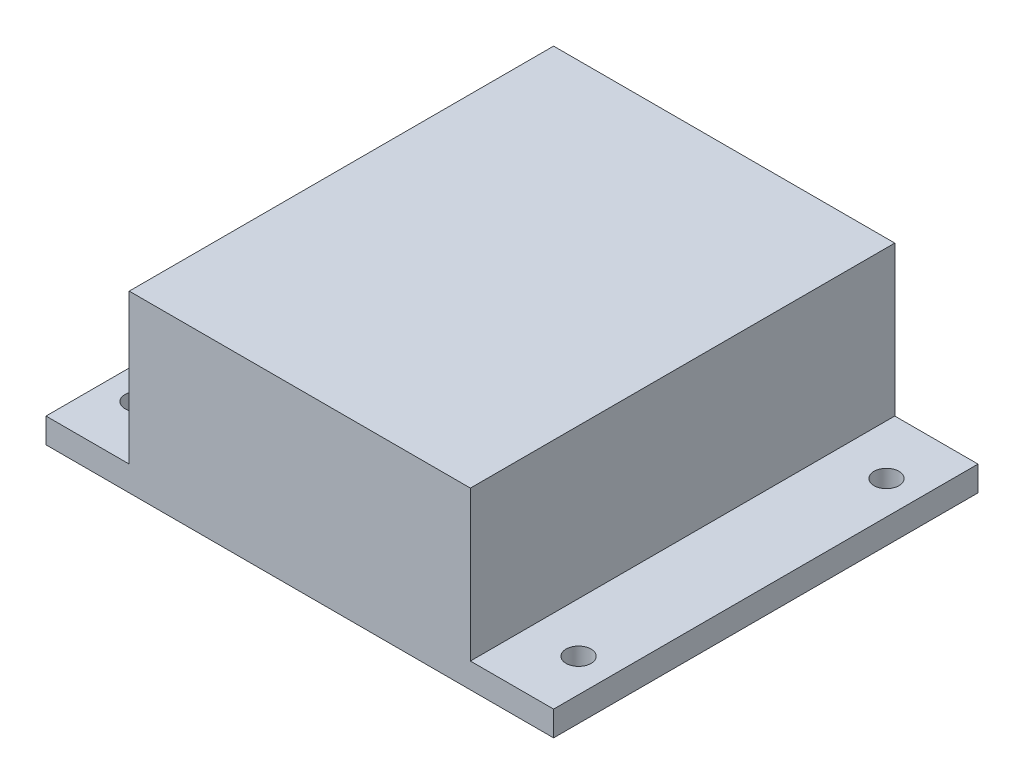
ISO-10303-21;
HEADER;
FILE_DESCRIPTION(('STEP AP214'),'2;1');
FILE_NAME('part.step','',(''),(''),'','','');
FILE_SCHEMA(('AUTOMOTIVE_DESIGN { 1 0 10303 214 1 1 1 1 }'));
ENDSEC;
DATA;
#1=APPLICATION_CONTEXT('core data for automotive mechanical design processes');
#2=APPLICATION_PROTOCOL_DEFINITION('international standard','automotive_design',2000,#1);
#3=PRODUCT_CONTEXT('',#1,'mechanical');
#4=PRODUCT('Part','Part','',(#3));
#5=PRODUCT_RELATED_PRODUCT_CATEGORY('part','',(#4));
#6=PRODUCT_DEFINITION_FORMATION('','',#4);
#7=PRODUCT_DEFINITION_CONTEXT('part definition',#1,'design');
#8=PRODUCT_DEFINITION('design','',#6,#7);
#9=PRODUCT_DEFINITION_SHAPE('','',#8);
#10=(LENGTH_UNIT() NAMED_UNIT(*) SI_UNIT(.MILLI.,.METRE.));
#11=(NAMED_UNIT(*) PLANE_ANGLE_UNIT() SI_UNIT($,.RADIAN.));
#12=(NAMED_UNIT(*) SI_UNIT($,.STERADIAN.) SOLID_ANGLE_UNIT());
#13=UNCERTAINTY_MEASURE_WITH_UNIT(LENGTH_MEASURE(1.E-05),#10,'distance_accuracy_value','');
#14=(GEOMETRIC_REPRESENTATION_CONTEXT(3) GLOBAL_UNCERTAINTY_ASSIGNED_CONTEXT((#13)) GLOBAL_UNIT_ASSIGNED_CONTEXT((#10,
#11,#12)) REPRESENTATION_CONTEXT('',''));
#15=CARTESIAN_POINT('',(0.,0.,0.));
#16=DIRECTION('',(0.,0.,1.));
#17=DIRECTION('',(1.,0.,0.));
#18=AXIS2_PLACEMENT_3D('',#15,#16,#17);
#19=CARTESIAN_POINT('',(30.5,21.,25.5));
#20=DIRECTION('',(-1.,0.,0.));
#21=DIRECTION('',(0.,0.,1.));
#22=AXIS2_PLACEMENT_3D('',#19,#20,#21);
#23=PLANE('',#22);
#24=DIRECTION('',(0.,0.,1.));
#25=VECTOR('',#24,1.);
#26=CARTESIAN_POINT('',(30.5,3.,25.5));
#27=LINE('',#26,#25);
#28=CARTESIAN_POINT('',(30.5,3.00000000000001,-25.5));
#29=VERTEX_POINT('',#28);
#30=CARTESIAN_POINT('',(30.5,3.,25.5));
#31=VERTEX_POINT('',#30);
#32=EDGE_CURVE('E52',#29,#31,#27,.T.);
#33=ORIENTED_EDGE('',*,*,#32,.T.);
#34=DIRECTION('',(0.,-1.,0.));
#35=VECTOR('',#34,1.);
#36=CARTESIAN_POINT('',(30.5,21.,25.5));
#37=LINE('',#36,#35);
#38=CARTESIAN_POINT('',(30.5,0.,25.5));
#39=VERTEX_POINT('',#38);
#40=EDGE_CURVE('E44',#31,#39,#37,.T.);
#41=ORIENTED_EDGE('',*,*,#40,.T.);
#42=DIRECTION('',(0.,0.,-1.));
#43=VECTOR('',#42,1.);
#44=CARTESIAN_POINT('',(30.5,0.,25.5));
#45=LINE('',#44,#43);
#46=CARTESIAN_POINT('',(30.5,0.,-25.5));
#47=VERTEX_POINT('',#46);
#48=EDGE_CURVE('E138',#39,#47,#45,.T.);
#49=ORIENTED_EDGE('',*,*,#48,.T.);
#50=DIRECTION('',(0.,-1.,0.));
#51=VECTOR('',#50,1.);
#52=CARTESIAN_POINT('',(30.5,21.,-25.5));
#53=LINE('',#52,#51);
#54=EDGE_CURVE('E125',#29,#47,#53,.T.);
#55=ORIENTED_EDGE('',*,*,#54,.F.);
#56=EDGE_LOOP('',(#33,#41,#49,#55));
#57=FACE_BOUND('',#56,.T.);
#58=ADVANCED_FACE('F35',(#57),#23,.F.);
#59=CARTESIAN_POINT('',(26.5,21.,18.5));
#60=DIRECTION('',(0.,-1.,0.));
#61=DIRECTION('',(0.,0.,-1.));
#62=AXIS2_PLACEMENT_3D('',#59,#60,#61);
#63=CYLINDRICAL_SURFACE('',#62,1.5);
#64=CARTESIAN_POINT('',(26.5,0.,18.5));
#65=DIRECTION('',(0.,1.,0.));
#66=DIRECTION('',(0.,0.,1.));
#67=AXIS2_PLACEMENT_3D('',#64,#65,#66);
#68=CIRCLE('',#67,1.5);
#69=CARTESIAN_POINT('',(26.5,0.,17.));
#70=VERTEX_POINT('',#69);
#71=EDGE_CURVE('E169',#70,#70,#68,.T.);
#72=CARTESIAN_POINT('',(26.5,3.,18.5));
#73=DIRECTION('',(0.,1.,0.));
#74=DIRECTION('',(0.,0.,1.));
#75=AXIS2_PLACEMENT_3D('',#72,#73,#74);
#76=CIRCLE('',#75,1.5);
#77=CARTESIAN_POINT('',(26.5,3.,17.));
#78=VERTEX_POINT('',#77);
#79=EDGE_CURVE('E213',#78,#78,#76,.T.);
#80=CARTESIAN_POINT('',(26.5,0.,17.));
#81=CARTESIAN_POINT('',(26.5,0.03125,17.));
#82=CARTESIAN_POINT('',(26.5,0.0625000000000001,17.));
#83=CARTESIAN_POINT('',(26.5,0.125,17.));
#84=CARTESIAN_POINT('',(26.5,0.15625,17.));
#85=CARTESIAN_POINT('',(26.5,0.21875,17.));
#86=CARTESIAN_POINT('',(26.5,0.25,17.));
#87=CARTESIAN_POINT('',(26.5,0.3125,17.));
#88=CARTESIAN_POINT('',(26.5,0.34375,17.));
#89=CARTESIAN_POINT('',(26.5,0.40625,17.));
#90=CARTESIAN_POINT('',(26.5,0.4375,17.));
#91=CARTESIAN_POINT('',(26.5,0.5,17.));
#92=CARTESIAN_POINT('',(26.5,0.53125,17.));
#93=CARTESIAN_POINT('',(26.5,0.593750000000001,17.));
#94=CARTESIAN_POINT('',(26.5,0.625000000000001,17.));
#95=CARTESIAN_POINT('',(26.5,0.687500000000001,17.));
#96=CARTESIAN_POINT('',(26.5,0.718750000000001,17.));
#97=CARTESIAN_POINT('',(26.5,0.78125,17.));
#98=CARTESIAN_POINT('',(26.5,0.812499999999998,17.));
#99=CARTESIAN_POINT('',(26.5,0.874999999999997,17.));
#100=CARTESIAN_POINT('',(26.5,0.906249999999997,17.));
#101=CARTESIAN_POINT('',(26.5,0.968749999999997,17.));
#102=CARTESIAN_POINT('',(26.5,0.999999999999997,17.));
#103=CARTESIAN_POINT('',(26.5,1.0625,17.));
#104=CARTESIAN_POINT('',(26.5,1.09375,17.));
#105=CARTESIAN_POINT('',(26.5,1.15625,17.));
#106=CARTESIAN_POINT('',(26.5,1.1875,17.));
#107=CARTESIAN_POINT('',(26.5,1.25,17.));
#108=CARTESIAN_POINT('',(26.5,1.28125,17.));
#109=CARTESIAN_POINT('',(26.5,1.34375,17.));
#110=CARTESIAN_POINT('',(26.5,1.375,17.));
#111=CARTESIAN_POINT('',(26.5,1.4375,17.));
#112=CARTESIAN_POINT('',(26.5,1.46875,17.));
#113=CARTESIAN_POINT('',(26.5,1.53125,17.));
#114=CARTESIAN_POINT('',(26.5,1.5625,17.));
#115=CARTESIAN_POINT('',(26.5,1.625,17.));
#116=CARTESIAN_POINT('',(26.5,1.65625,17.));
#117=CARTESIAN_POINT('',(26.5,1.71875,17.));
#118=CARTESIAN_POINT('',(26.5,1.75,17.));
#119=CARTESIAN_POINT('',(26.5,1.8125,17.));
#120=CARTESIAN_POINT('',(26.5,1.84375,17.));
#121=CARTESIAN_POINT('',(26.5,1.90625,17.));
#122=CARTESIAN_POINT('',(26.5,1.9375,17.));
#123=CARTESIAN_POINT('',(26.5,2.,17.));
#124=CARTESIAN_POINT('',(26.5,2.03125,17.));
#125=CARTESIAN_POINT('',(26.5,2.09375,17.));
#126=CARTESIAN_POINT('',(26.5,2.125,17.));
#127=CARTESIAN_POINT('',(26.5,2.1875,17.));
#128=CARTESIAN_POINT('',(26.5,2.21875,17.));
#129=CARTESIAN_POINT('',(26.5,2.28125,17.));
#130=CARTESIAN_POINT('',(26.5,2.3125,17.));
#131=CARTESIAN_POINT('',(26.5,2.375,17.));
#132=CARTESIAN_POINT('',(26.5,2.40625,17.));
#133=CARTESIAN_POINT('',(26.5,2.46875,17.));
#134=CARTESIAN_POINT('',(26.5,2.5,17.));
#135=CARTESIAN_POINT('',(26.5,2.5625,17.));
#136=CARTESIAN_POINT('',(26.5,2.59375,17.));
#137=CARTESIAN_POINT('',(26.5,2.65625,17.));
#138=CARTESIAN_POINT('',(26.5,2.6875,17.));
#139=CARTESIAN_POINT('',(26.5,2.75,17.));
#140=CARTESIAN_POINT('',(26.5,2.78125,17.));
#141=CARTESIAN_POINT('',(26.5,2.84375,17.));
#142=CARTESIAN_POINT('',(26.5,2.875,17.));
#143=CARTESIAN_POINT('',(26.5,2.9375,17.));
#144=CARTESIAN_POINT('',(26.5,2.96875,17.));
#145=CARTESIAN_POINT('',(26.5,3.,17.));
#146=B_SPLINE_CURVE_WITH_KNOTS('',3,(#80,#81,#82,#83,#84,#85,#86,#87,#88,#89,#90,#91,#92,#93,
#94,#95,#96,#97,#98,#99,#100,#101,#102,#103,#104,#105,#106,#107,#108,#109,#110,#111,#112,#113,
#114,#115,#116,#117,#118,#119,#120,#121,#122,#123,#124,#125,#126,#127,#128,#129,#130,#131,#132,
#133,#134,#135,#136,#137,#138,#139,#140,#141,#142,#143,#144,#145),.UNSPECIFIED.,.F.,.F.,(4,2,2,
2,2,2,2,2,2,2,2,2,2,2,2,2,2,2,2,2,2,2,2,2,2,2,2,2,2,2,2,2,4),(0.,0.0937500000000001,0.1875,
0.28125,0.375,0.46875,0.5625,0.656250000000001,0.750000000000001,0.843749999999997,
0.937499999999997,1.03125,1.125,1.21875,1.3125,1.40625,1.5,1.59375,1.6875,1.78125,1.875,1.96875,
2.0625,2.15625,2.25,2.34375,2.4375,2.53125,2.625,2.71875,2.8125,2.90625,3.),.UNSPECIFIED.);
#147=EDGE_CURVE('BSEAM228',#70,#78,#146,.T.);
#148=ORIENTED_EDGE('',*,*,#71,.F.);
#149=ORIENTED_EDGE('',*,*,#79,.T.);
#150=ORIENTED_EDGE('',*,*,#147,.T.);
#151=ORIENTED_EDGE('',*,*,#147,.F.);
#152=EDGE_LOOP('',(#148,#150,#149,#151));
#153=FACE_BOUND('',#152,.T.);
#154=ADVANCED_FACE('F228',(#153),#63,.F.);
#155=CARTESIAN_POINT('',(26.5,21.,-18.5));
#156=DIRECTION('',(0.,-1.,0.));
#157=DIRECTION('',(0.,0.,-1.));
#158=AXIS2_PLACEMENT_3D('',#155,#156,#157);
#159=CYLINDRICAL_SURFACE('',#158,1.5);
#160=CARTESIAN_POINT('',(26.5,0.,-18.5));
#161=DIRECTION('',(0.,1.,0.));
#162=DIRECTION('',(0.,0.,1.));
#163=AXIS2_PLACEMENT_3D('',#160,#161,#162);
#164=CIRCLE('',#163,1.5);
#165=CARTESIAN_POINT('',(26.5,0.,-20.));
#166=VERTEX_POINT('',#165);
#167=EDGE_CURVE('E151',#166,#166,#164,.T.);
#168=CARTESIAN_POINT('',(26.5,3.,-18.5));
#169=DIRECTION('',(0.,1.,0.));
#170=DIRECTION('',(0.,0.,1.));
#171=AXIS2_PLACEMENT_3D('',#168,#169,#170);
#172=CIRCLE('',#171,1.5);
#173=CARTESIAN_POINT('',(26.5,3.,-20.));
#174=VERTEX_POINT('',#173);
#175=EDGE_CURVE('E39',#174,#174,#172,.T.);
#176=CARTESIAN_POINT('',(26.5,0.,-20.));
#177=CARTESIAN_POINT('',(26.5,0.03125,-20.));
#178=CARTESIAN_POINT('',(26.5,0.0625000000000001,-20.));
#179=CARTESIAN_POINT('',(26.5,0.125,-20.));
#180=CARTESIAN_POINT('',(26.5,0.15625,-20.));
#181=CARTESIAN_POINT('',(26.5,0.21875,-20.));
#182=CARTESIAN_POINT('',(26.5,0.25,-20.));
#183=CARTESIAN_POINT('',(26.5,0.3125,-20.));
#184=CARTESIAN_POINT('',(26.5,0.34375,-20.));
#185=CARTESIAN_POINT('',(26.5,0.40625,-20.));
#186=CARTESIAN_POINT('',(26.5,0.4375,-20.));
#187=CARTESIAN_POINT('',(26.5,0.5,-20.));
#188=CARTESIAN_POINT('',(26.5,0.53125,-20.));
#189=CARTESIAN_POINT('',(26.5,0.593750000000001,-20.));
#190=CARTESIAN_POINT('',(26.5,0.625000000000001,-20.));
#191=CARTESIAN_POINT('',(26.5,0.687500000000001,-20.));
#192=CARTESIAN_POINT('',(26.5,0.718750000000001,-20.));
#193=CARTESIAN_POINT('',(26.5,0.78125,-20.));
#194=CARTESIAN_POINT('',(26.5,0.812499999999998,-20.));
#195=CARTESIAN_POINT('',(26.5,0.874999999999997,-20.));
#196=CARTESIAN_POINT('',(26.5,0.906249999999997,-20.));
#197=CARTESIAN_POINT('',(26.5,0.968749999999997,-20.));
#198=CARTESIAN_POINT('',(26.5,0.999999999999997,-20.));
#199=CARTESIAN_POINT('',(26.5,1.0625,-20.));
#200=CARTESIAN_POINT('',(26.5,1.09375,-20.));
#201=CARTESIAN_POINT('',(26.5,1.15625,-20.));
#202=CARTESIAN_POINT('',(26.5,1.1875,-20.));
#203=CARTESIAN_POINT('',(26.5,1.25,-20.));
#204=CARTESIAN_POINT('',(26.5,1.28125,-20.));
#205=CARTESIAN_POINT('',(26.5,1.34375,-20.));
#206=CARTESIAN_POINT('',(26.5,1.375,-20.));
#207=CARTESIAN_POINT('',(26.5,1.4375,-20.));
#208=CARTESIAN_POINT('',(26.5,1.46875,-20.));
#209=CARTESIAN_POINT('',(26.5,1.53125,-20.));
#210=CARTESIAN_POINT('',(26.5,1.5625,-20.));
#211=CARTESIAN_POINT('',(26.5,1.625,-20.));
#212=CARTESIAN_POINT('',(26.5,1.65625,-20.));
#213=CARTESIAN_POINT('',(26.5,1.71875,-20.));
#214=CARTESIAN_POINT('',(26.5,1.75,-20.));
#215=CARTESIAN_POINT('',(26.5,1.8125,-20.));
#216=CARTESIAN_POINT('',(26.5,1.84375,-20.));
#217=CARTESIAN_POINT('',(26.5,1.90625,-20.));
#218=CARTESIAN_POINT('',(26.5,1.9375,-20.));
#219=CARTESIAN_POINT('',(26.5,2.,-20.));
#220=CARTESIAN_POINT('',(26.5,2.03125,-20.));
#221=CARTESIAN_POINT('',(26.5,2.09375,-20.));
#222=CARTESIAN_POINT('',(26.5,2.125,-20.));
#223=CARTESIAN_POINT('',(26.5,2.1875,-20.));
#224=CARTESIAN_POINT('',(26.5,2.21875,-20.));
#225=CARTESIAN_POINT('',(26.5,2.28125,-20.));
#226=CARTESIAN_POINT('',(26.5,2.3125,-20.));
#227=CARTESIAN_POINT('',(26.5,2.375,-20.));
#228=CARTESIAN_POINT('',(26.5,2.40625,-20.));
#229=CARTESIAN_POINT('',(26.5,2.46875,-20.));
#230=CARTESIAN_POINT('',(26.5,2.5,-20.));
#231=CARTESIAN_POINT('',(26.5,2.5625,-20.));
#232=CARTESIAN_POINT('',(26.5,2.59375,-20.));
#233=CARTESIAN_POINT('',(26.5,2.65625,-20.));
#234=CARTESIAN_POINT('',(26.5,2.6875,-20.));
#235=CARTESIAN_POINT('',(26.5,2.75,-20.));
#236=CARTESIAN_POINT('',(26.5,2.78125,-20.));
#237=CARTESIAN_POINT('',(26.5,2.84375,-20.));
#238=CARTESIAN_POINT('',(26.5,2.875,-20.));
#239=CARTESIAN_POINT('',(26.5,2.9375,-20.));
#240=CARTESIAN_POINT('',(26.5,2.96875,-20.));
#241=CARTESIAN_POINT('',(26.5,3.,-20.));
#242=B_SPLINE_CURVE_WITH_KNOTS('',3,(#176,#177,#178,#179,#180,#181,#182,#183,#184,#185,#186,
#187,#188,#189,#190,#191,#192,#193,#194,#195,#196,#197,#198,#199,#200,#201,#202,#203,#204,#205,
#206,#207,#208,#209,#210,#211,#212,#213,#214,#215,#216,#217,#218,#219,#220,#221,#222,#223,#224,
#225,#226,#227,#228,#229,#230,#231,#232,#233,#234,#235,#236,#237,#238,#239,#240,#241),
.UNSPECIFIED.,.F.,.F.,(4,2,2,2,2,2,2,2,2,2,2,2,2,2,2,2,2,2,2,2,2,2,2,2,2,2,2,2,2,2,2,2,4),(0.,
0.0937500000000001,0.1875,0.28125,0.375,0.46875,0.5625,0.656250000000001,0.750000000000001,
0.843749999999997,0.937499999999997,1.03125,1.125,1.21875,1.3125,1.40625,1.5,1.59375,1.6875,
1.78125,1.875,1.96875,2.0625,2.15625,2.25,2.34375,2.4375,2.53125,2.625,2.71875,2.8125,2.90625,
3.),.UNSPECIFIED.);
#243=EDGE_CURVE('BSEAM233',#166,#174,#242,.T.);
#244=ORIENTED_EDGE('',*,*,#167,.F.);
#245=ORIENTED_EDGE('',*,*,#175,.T.);
#246=ORIENTED_EDGE('',*,*,#243,.T.);
#247=ORIENTED_EDGE('',*,*,#243,.F.);
#248=EDGE_LOOP('',(#244,#246,#245,#247));
#249=FACE_BOUND('',#248,.T.);
#250=ADVANCED_FACE('F233',(#249),#159,.F.);
#251=CARTESIAN_POINT('',(-30.5,21.,25.5));
#252=DIRECTION('',(1.,0.,0.));
#253=DIRECTION('',(0.,0.,-1.));
#254=AXIS2_PLACEMENT_3D('',#251,#252,#253);
#255=PLANE('',#254);
#256=DIRECTION('',(0.,0.,-1.));
#257=VECTOR('',#256,1.);
#258=CARTESIAN_POINT('',(-30.5,3.,-25.5));
#259=LINE('',#258,#257);
#260=CARTESIAN_POINT('',(-30.5,3.,25.5));
#261=VERTEX_POINT('',#260);
#262=CARTESIAN_POINT('',(-30.5,3.,-25.5));
#263=VERTEX_POINT('',#262);
#264=EDGE_CURVE('E154',#261,#263,#259,.T.);
#265=ORIENTED_EDGE('',*,*,#264,.T.);
#266=DIRECTION('',(0.,-1.,0.));
#267=VECTOR('',#266,1.);
#268=CARTESIAN_POINT('',(-30.5,21.,-25.5));
#269=LINE('',#268,#267);
#270=CARTESIAN_POINT('',(-30.5,0.,-25.5));
#271=VERTEX_POINT('',#270);
#272=EDGE_CURVE('E123',#263,#271,#269,.T.);
#273=ORIENTED_EDGE('',*,*,#272,.T.);
#274=DIRECTION('',(0.,0.,1.));
#275=VECTOR('',#274,1.);
#276=CARTESIAN_POINT('',(-30.5,0.,25.5));
#277=LINE('',#276,#275);
#278=CARTESIAN_POINT('',(-30.5,0.,25.5));
#279=VERTEX_POINT('',#278);
#280=EDGE_CURVE('E131',#271,#279,#277,.T.);
#281=ORIENTED_EDGE('',*,*,#280,.T.);
#282=DIRECTION('',(0.,-1.,0.));
#283=VECTOR('',#282,1.);
#284=CARTESIAN_POINT('',(-30.5,21.,25.5));
#285=LINE('',#284,#283);
#286=EDGE_CURVE('E12',#261,#279,#285,.T.);
#287=ORIENTED_EDGE('',*,*,#286,.F.);
#288=EDGE_LOOP('',(#265,#273,#281,#287));
#289=FACE_BOUND('',#288,.T.);
#290=ADVANCED_FACE('F37',(#289),#255,.F.);
#291=CARTESIAN_POINT('',(-26.5,21.,-18.5));
#292=DIRECTION('',(0.,-1.,0.));
#293=DIRECTION('',(0.,0.,-1.));
#294=AXIS2_PLACEMENT_3D('',#291,#292,#293);
#295=CYLINDRICAL_SURFACE('',#294,1.5);
#296=CARTESIAN_POINT('',(-26.5,0.,-18.5));
#297=DIRECTION('',(0.,1.,0.));
#298=DIRECTION('',(0.,0.,1.));
#299=AXIS2_PLACEMENT_3D('',#296,#297,#298);
#300=CIRCLE('',#299,1.5);
#301=CARTESIAN_POINT('',(-26.5,0.,-20.));
#302=VERTEX_POINT('',#301);
#303=EDGE_CURVE('E135',#302,#302,#300,.T.);
#304=CARTESIAN_POINT('',(-26.5,3.,-18.5));
#305=DIRECTION('',(0.,1.,0.));
#306=DIRECTION('',(0.,0.,1.));
#307=AXIS2_PLACEMENT_3D('',#304,#305,#306);
#308=CIRCLE('',#307,1.5);
#309=CARTESIAN_POINT('',(-26.5,3.,-20.));
#310=VERTEX_POINT('',#309);
#311=EDGE_CURVE('E146',#310,#310,#308,.T.);
#312=CARTESIAN_POINT('',(-26.5,0.,-20.));
#313=CARTESIAN_POINT('',(-26.5,0.03125,-20.));
#314=CARTESIAN_POINT('',(-26.5,0.0625000000000001,-20.));
#315=CARTESIAN_POINT('',(-26.5,0.125,-20.));
#316=CARTESIAN_POINT('',(-26.5,0.15625,-20.));
#317=CARTESIAN_POINT('',(-26.5,0.21875,-20.));
#318=CARTESIAN_POINT('',(-26.5,0.25,-20.));
#319=CARTESIAN_POINT('',(-26.5,0.3125,-20.));
#320=CARTESIAN_POINT('',(-26.5,0.34375,-20.));
#321=CARTESIAN_POINT('',(-26.5,0.40625,-20.));
#322=CARTESIAN_POINT('',(-26.5,0.4375,-20.));
#323=CARTESIAN_POINT('',(-26.5,0.5,-20.));
#324=CARTESIAN_POINT('',(-26.5,0.53125,-20.));
#325=CARTESIAN_POINT('',(-26.5,0.593750000000001,-20.));
#326=CARTESIAN_POINT('',(-26.5,0.625000000000001,-20.));
#327=CARTESIAN_POINT('',(-26.5,0.687500000000001,-20.));
#328=CARTESIAN_POINT('',(-26.5,0.718750000000001,-20.));
#329=CARTESIAN_POINT('',(-26.5,0.78125,-20.));
#330=CARTESIAN_POINT('',(-26.5,0.812499999999998,-20.));
#331=CARTESIAN_POINT('',(-26.5,0.874999999999997,-20.));
#332=CARTESIAN_POINT('',(-26.5,0.906249999999997,-20.));
#333=CARTESIAN_POINT('',(-26.5,0.968749999999997,-20.));
#334=CARTESIAN_POINT('',(-26.5,0.999999999999997,-20.));
#335=CARTESIAN_POINT('',(-26.5,1.0625,-20.));
#336=CARTESIAN_POINT('',(-26.5,1.09375,-20.));
#337=CARTESIAN_POINT('',(-26.5,1.15625,-20.));
#338=CARTESIAN_POINT('',(-26.5,1.1875,-20.));
#339=CARTESIAN_POINT('',(-26.5,1.25,-20.));
#340=CARTESIAN_POINT('',(-26.5,1.28125,-20.));
#341=CARTESIAN_POINT('',(-26.5,1.34375,-20.));
#342=CARTESIAN_POINT('',(-26.5,1.375,-20.));
#343=CARTESIAN_POINT('',(-26.5,1.4375,-20.));
#344=CARTESIAN_POINT('',(-26.5,1.46875,-20.));
#345=CARTESIAN_POINT('',(-26.5,1.53125,-20.));
#346=CARTESIAN_POINT('',(-26.5,1.5625,-20.));
#347=CARTESIAN_POINT('',(-26.5,1.625,-20.));
#348=CARTESIAN_POINT('',(-26.5,1.65625,-20.));
#349=CARTESIAN_POINT('',(-26.5,1.71875,-20.));
#350=CARTESIAN_POINT('',(-26.5,1.75,-20.));
#351=CARTESIAN_POINT('',(-26.5,1.8125,-20.));
#352=CARTESIAN_POINT('',(-26.5,1.84375,-20.));
#353=CARTESIAN_POINT('',(-26.5,1.90625,-20.));
#354=CARTESIAN_POINT('',(-26.5,1.9375,-20.));
#355=CARTESIAN_POINT('',(-26.5,2.,-20.));
#356=CARTESIAN_POINT('',(-26.5,2.03125,-20.));
#357=CARTESIAN_POINT('',(-26.5,2.09375,-20.));
#358=CARTESIAN_POINT('',(-26.5,2.125,-20.));
#359=CARTESIAN_POINT('',(-26.5,2.1875,-20.));
#360=CARTESIAN_POINT('',(-26.5,2.21875,-20.));
#361=CARTESIAN_POINT('',(-26.5,2.28125,-20.));
#362=CARTESIAN_POINT('',(-26.5,2.3125,-20.));
#363=CARTESIAN_POINT('',(-26.5,2.375,-20.));
#364=CARTESIAN_POINT('',(-26.5,2.40625,-20.));
#365=CARTESIAN_POINT('',(-26.5,2.46875,-20.));
#366=CARTESIAN_POINT('',(-26.5,2.5,-20.));
#367=CARTESIAN_POINT('',(-26.5,2.5625,-20.));
#368=CARTESIAN_POINT('',(-26.5,2.59375,-20.));
#369=CARTESIAN_POINT('',(-26.5,2.65625,-20.));
#370=CARTESIAN_POINT('',(-26.5,2.6875,-20.));
#371=CARTESIAN_POINT('',(-26.5,2.75,-20.));
#372=CARTESIAN_POINT('',(-26.5,2.78125,-20.));
#373=CARTESIAN_POINT('',(-26.5,2.84375,-20.));
#374=CARTESIAN_POINT('',(-26.5,2.875,-20.));
#375=CARTESIAN_POINT('',(-26.5,2.9375,-20.));
#376=CARTESIAN_POINT('',(-26.5,2.96875,-20.));
#377=CARTESIAN_POINT('',(-26.5,3.,-20.));
#378=B_SPLINE_CURVE_WITH_KNOTS('',3,(#312,#313,#314,#315,#316,#317,#318,#319,#320,#321,#322,
#323,#324,#325,#326,#327,#328,#329,#330,#331,#332,#333,#334,#335,#336,#337,#338,#339,#340,#341,
#342,#343,#344,#345,#346,#347,#348,#349,#350,#351,#352,#353,#354,#355,#356,#357,#358,#359,#360,
#361,#362,#363,#364,#365,#366,#367,#368,#369,#370,#371,#372,#373,#374,#375,#376,#377),
.UNSPECIFIED.,.F.,.F.,(4,2,2,2,2,2,2,2,2,2,2,2,2,2,2,2,2,2,2,2,2,2,2,2,2,2,2,2,2,2,2,2,4),(0.,
0.0937500000000001,0.1875,0.28125,0.375,0.46875,0.5625,0.656250000000001,0.750000000000001,
0.843749999999997,0.937499999999997,1.03125,1.125,1.21875,1.3125,1.40625,1.5,1.59375,1.6875,
1.78125,1.875,1.96875,2.0625,2.15625,2.25,2.34375,2.4375,2.53125,2.625,2.71875,2.8125,2.90625,
3.),.UNSPECIFIED.);
#379=EDGE_CURVE('BSEAM180',#302,#310,#378,.T.);
#380=ORIENTED_EDGE('',*,*,#303,.F.);
#381=ORIENTED_EDGE('',*,*,#311,.T.);
#382=ORIENTED_EDGE('',*,*,#379,.T.);
#383=ORIENTED_EDGE('',*,*,#379,.F.);
#384=EDGE_LOOP('',(#380,#382,#381,#383));
#385=FACE_BOUND('',#384,.T.);
#386=ADVANCED_FACE('F180',(#385),#295,.F.);
#387=CARTESIAN_POINT('',(-26.5,21.,18.5));
#388=DIRECTION('',(0.,-1.,0.));
#389=DIRECTION('',(0.,0.,-1.));
#390=AXIS2_PLACEMENT_3D('',#387,#388,#389);
#391=CYLINDRICAL_SURFACE('',#390,1.5);
#392=CARTESIAN_POINT('',(-26.5,0.,18.5));
#393=DIRECTION('',(0.,1.,0.));
#394=DIRECTION('',(0.,0.,1.));
#395=AXIS2_PLACEMENT_3D('',#392,#393,#394);
#396=CIRCLE('',#395,1.5);
#397=CARTESIAN_POINT('',(-26.5,0.,17.));
#398=VERTEX_POINT('',#397);
#399=EDGE_CURVE('E172',#398,#398,#396,.T.);
#400=CARTESIAN_POINT('',(-26.5,3.,18.5));
#401=DIRECTION('',(0.,1.,0.));
#402=DIRECTION('',(0.,0.,1.));
#403=AXIS2_PLACEMENT_3D('',#400,#401,#402);
#404=CIRCLE('',#403,1.5);
#405=CARTESIAN_POINT('',(-26.5,3.,17.));
#406=VERTEX_POINT('',#405);
#407=EDGE_CURVE('E144',#406,#406,#404,.T.);
#408=CARTESIAN_POINT('',(-26.5,0.,17.));
#409=CARTESIAN_POINT('',(-26.5,0.03125,17.));
#410=CARTESIAN_POINT('',(-26.5,0.0625000000000001,17.));
#411=CARTESIAN_POINT('',(-26.5,0.125,17.));
#412=CARTESIAN_POINT('',(-26.5,0.15625,17.));
#413=CARTESIAN_POINT('',(-26.5,0.21875,17.));
#414=CARTESIAN_POINT('',(-26.5,0.25,17.));
#415=CARTESIAN_POINT('',(-26.5,0.3125,17.));
#416=CARTESIAN_POINT('',(-26.5,0.34375,17.));
#417=CARTESIAN_POINT('',(-26.5,0.40625,17.));
#418=CARTESIAN_POINT('',(-26.5,0.4375,17.));
#419=CARTESIAN_POINT('',(-26.5,0.5,17.));
#420=CARTESIAN_POINT('',(-26.5,0.53125,17.));
#421=CARTESIAN_POINT('',(-26.5,0.593750000000001,17.));
#422=CARTESIAN_POINT('',(-26.5,0.625000000000001,17.));
#423=CARTESIAN_POINT('',(-26.5,0.687500000000001,17.));
#424=CARTESIAN_POINT('',(-26.5,0.718750000000001,17.));
#425=CARTESIAN_POINT('',(-26.5,0.78125,17.));
#426=CARTESIAN_POINT('',(-26.5,0.812499999999998,17.));
#427=CARTESIAN_POINT('',(-26.5,0.874999999999997,17.));
#428=CARTESIAN_POINT('',(-26.5,0.906249999999997,17.));
#429=CARTESIAN_POINT('',(-26.5,0.968749999999997,17.));
#430=CARTESIAN_POINT('',(-26.5,0.999999999999997,17.));
#431=CARTESIAN_POINT('',(-26.5,1.0625,17.));
#432=CARTESIAN_POINT('',(-26.5,1.09375,17.));
#433=CARTESIAN_POINT('',(-26.5,1.15625,17.));
#434=CARTESIAN_POINT('',(-26.5,1.1875,17.));
#435=CARTESIAN_POINT('',(-26.5,1.25,17.));
#436=CARTESIAN_POINT('',(-26.5,1.28125,17.));
#437=CARTESIAN_POINT('',(-26.5,1.34375,17.));
#438=CARTESIAN_POINT('',(-26.5,1.375,17.));
#439=CARTESIAN_POINT('',(-26.5,1.4375,17.));
#440=CARTESIAN_POINT('',(-26.5,1.46875,17.));
#441=CARTESIAN_POINT('',(-26.5,1.53125,17.));
#442=CARTESIAN_POINT('',(-26.5,1.5625,17.));
#443=CARTESIAN_POINT('',(-26.5,1.625,17.));
#444=CARTESIAN_POINT('',(-26.5,1.65625,17.));
#445=CARTESIAN_POINT('',(-26.5,1.71875,17.));
#446=CARTESIAN_POINT('',(-26.5,1.75,17.));
#447=CARTESIAN_POINT('',(-26.5,1.8125,17.));
#448=CARTESIAN_POINT('',(-26.5,1.84375,17.));
#449=CARTESIAN_POINT('',(-26.5,1.90625,17.));
#450=CARTESIAN_POINT('',(-26.5,1.9375,17.));
#451=CARTESIAN_POINT('',(-26.5,2.,17.));
#452=CARTESIAN_POINT('',(-26.5,2.03125,17.));
#453=CARTESIAN_POINT('',(-26.5,2.09375,17.));
#454=CARTESIAN_POINT('',(-26.5,2.125,17.));
#455=CARTESIAN_POINT('',(-26.5,2.1875,17.));
#456=CARTESIAN_POINT('',(-26.5,2.21875,17.));
#457=CARTESIAN_POINT('',(-26.5,2.28125,17.));
#458=CARTESIAN_POINT('',(-26.5,2.3125,17.));
#459=CARTESIAN_POINT('',(-26.5,2.375,17.));
#460=CARTESIAN_POINT('',(-26.5,2.40625,17.));
#461=CARTESIAN_POINT('',(-26.5,2.46875,17.));
#462=CARTESIAN_POINT('',(-26.5,2.5,17.));
#463=CARTESIAN_POINT('',(-26.5,2.5625,17.));
#464=CARTESIAN_POINT('',(-26.5,2.59375,17.));
#465=CARTESIAN_POINT('',(-26.5,2.65625,17.));
#466=CARTESIAN_POINT('',(-26.5,2.6875,17.));
#467=CARTESIAN_POINT('',(-26.5,2.75,17.));
#468=CARTESIAN_POINT('',(-26.5,2.78125,17.));
#469=CARTESIAN_POINT('',(-26.5,2.84375,17.));
#470=CARTESIAN_POINT('',(-26.5,2.875,17.));
#471=CARTESIAN_POINT('',(-26.5,2.9375,17.));
#472=CARTESIAN_POINT('',(-26.5,2.96875,17.));
#473=CARTESIAN_POINT('',(-26.5,3.,17.));
#474=B_SPLINE_CURVE_WITH_KNOTS('',3,(#408,#409,#410,#411,#412,#413,#414,#415,#416,#417,#418,
#419,#420,#421,#422,#423,#424,#425,#426,#427,#428,#429,#430,#431,#432,#433,#434,#435,#436,#437,
#438,#439,#440,#441,#442,#443,#444,#445,#446,#447,#448,#449,#450,#451,#452,#453,#454,#455,#456,
#457,#458,#459,#460,#461,#462,#463,#464,#465,#466,#467,#468,#469,#470,#471,#472,#473),
.UNSPECIFIED.,.F.,.F.,(4,2,2,2,2,2,2,2,2,2,2,2,2,2,2,2,2,2,2,2,2,2,2,2,2,2,2,2,2,2,2,2,4),(0.,
0.0937500000000001,0.1875,0.28125,0.375,0.46875,0.5625,0.656250000000001,0.750000000000001,
0.843749999999997,0.937499999999997,1.03125,1.125,1.21875,1.3125,1.40625,1.5,1.59375,1.6875,
1.78125,1.875,1.96875,2.0625,2.15625,2.25,2.34375,2.4375,2.53125,2.625,2.71875,2.8125,2.90625,
3.),.UNSPECIFIED.);
#475=EDGE_CURVE('BSEAM183',#398,#406,#474,.T.);
#476=ORIENTED_EDGE('',*,*,#399,.F.);
#477=ORIENTED_EDGE('',*,*,#407,.T.);
#478=ORIENTED_EDGE('',*,*,#475,.T.);
#479=ORIENTED_EDGE('',*,*,#475,.F.);
#480=EDGE_LOOP('',(#476,#478,#477,#479));
#481=FACE_BOUND('',#480,.T.);
#482=ADVANCED_FACE('F183',(#481),#391,.F.);
#483=CARTESIAN_POINT('',(0.,21.,0.));
#484=DIRECTION('',(0.,1.,0.));
#485=DIRECTION('',(0.,0.,1.));
#486=AXIS2_PLACEMENT_3D('',#483,#484,#485);
#487=PLANE('',#486);
#488=DIRECTION('',(0.,0.,1.));
#489=VECTOR('',#488,1.);
#490=CARTESIAN_POINT('',(20.5,21.,25.5));
#491=LINE('',#490,#489);
#492=CARTESIAN_POINT('',(20.5,21.,-25.5));
#493=VERTEX_POINT('',#492);
#494=CARTESIAN_POINT('',(20.5,21.,25.5));
#495=VERTEX_POINT('',#494);
#496=EDGE_CURVE('E106',#493,#495,#491,.T.);
#497=ORIENTED_EDGE('',*,*,#496,.F.);
#498=DIRECTION('',(-1.,0.,0.));
#499=VECTOR('',#498,1.);
#500=CARTESIAN_POINT('',(30.5,21.,-25.5));
#501=LINE('',#500,#499);
#502=CARTESIAN_POINT('',(-20.5,21.,-25.5));
#503=VERTEX_POINT('',#502);
#504=EDGE_CURVE('E117',#493,#503,#501,.T.);
#505=ORIENTED_EDGE('',*,*,#504,.T.);
#506=DIRECTION('',(0.,0.,-1.));
#507=VECTOR('',#506,1.);
#508=CARTESIAN_POINT('',(-20.5,21.,-25.5));
#509=LINE('',#508,#507);
#510=CARTESIAN_POINT('',(-20.5,21.,25.5));
#511=VERTEX_POINT('',#510);
#512=EDGE_CURVE('E216',#511,#503,#509,.T.);
#513=ORIENTED_EDGE('',*,*,#512,.F.);
#514=DIRECTION('',(1.,0.,0.));
#515=VECTOR('',#514,1.);
#516=CARTESIAN_POINT('',(30.5,21.,25.5));
#517=LINE('',#516,#515);
#518=EDGE_CURVE('E119',#511,#495,#517,.T.);
#519=ORIENTED_EDGE('',*,*,#518,.T.);
#520=EDGE_LOOP('',(#497,#505,#513,#519));
#521=FACE_BOUND('',#520,.T.);
#522=ADVANCED_FACE('F115',(#521),#487,.T.);
#523=CARTESIAN_POINT('',(0.,0.,0.));
#524=DIRECTION('',(0.,1.,0.));
#525=DIRECTION('',(0.,0.,1.));
#526=AXIS2_PLACEMENT_3D('',#523,#524,#525);
#527=PLANE('',#526);
#528=ORIENTED_EDGE('',*,*,#280,.F.);
#529=DIRECTION('',(-1.,0.,0.));
#530=VECTOR('',#529,1.);
#531=CARTESIAN_POINT('',(30.5,0.,-25.5));
#532=LINE('',#531,#530);
#533=EDGE_CURVE('E127',#47,#271,#532,.T.);
#534=ORIENTED_EDGE('',*,*,#533,.F.);
#535=ORIENTED_EDGE('',*,*,#48,.F.);
#536=DIRECTION('',(1.,0.,0.));
#537=VECTOR('',#536,1.);
#538=CARTESIAN_POINT('',(30.5,0.,25.5));
#539=LINE('',#538,#537);
#540=EDGE_CURVE('E134',#279,#39,#539,.T.);
#541=ORIENTED_EDGE('',*,*,#540,.F.);
#542=EDGE_LOOP('',(#528,#534,#535,#541));
#543=FACE_BOUND('',#542,.T.);
#544=ORIENTED_EDGE('',*,*,#303,.T.);
#545=EDGE_LOOP('',(#544));
#546=FACE_BOUND('',#545,.T.);
#547=ORIENTED_EDGE('',*,*,#399,.T.);
#548=EDGE_LOOP('',(#547));
#549=FACE_BOUND('',#548,.T.);
#550=ORIENTED_EDGE('',*,*,#71,.T.);
#551=EDGE_LOOP('',(#550));
#552=FACE_BOUND('',#551,.T.);
#553=ORIENTED_EDGE('',*,*,#167,.T.);
#554=EDGE_LOOP('',(#553));
#555=FACE_BOUND('',#554,.T.);
#556=ADVANCED_FACE('F177',(#543,#546,#549,#552,#555),#527,.F.);
#557=CARTESIAN_POINT('',(30.5,21.,25.5));
#558=DIRECTION('',(0.,0.,-1.));
#559=DIRECTION('',(-1.,0.,0.));
#560=AXIS2_PLACEMENT_3D('',#557,#558,#559);
#561=PLANE('',#560);
#562=DIRECTION('',(-1.,0.,0.));
#563=VECTOR('',#562,1.);
#564=CARTESIAN_POINT('',(30.5,3.,25.5));
#565=LINE('',#564,#563);
#566=CARTESIAN_POINT('',(20.5,3.,25.5));
#567=VERTEX_POINT('',#566);
#568=EDGE_CURVE('E204',#31,#567,#565,.T.);
#569=ORIENTED_EDGE('',*,*,#568,.T.);
#570=DIRECTION('',(0.,1.,0.));
#571=VECTOR('',#570,1.);
#572=CARTESIAN_POINT('',(20.5,-51.9711458407451,25.5));
#573=LINE('',#572,#571);
#574=EDGE_CURVE('E111',#567,#495,#573,.T.);
#575=ORIENTED_EDGE('',*,*,#574,.T.);
#576=ORIENTED_EDGE('',*,*,#518,.F.);
#577=DIRECTION('',(0.,1.,0.));
#578=VECTOR('',#577,1.);
#579=CARTESIAN_POINT('',(-20.5,-51.9711458407451,25.5));
#580=LINE('',#579,#578);
#581=CARTESIAN_POINT('',(-20.5,3.,25.5));
#582=VERTEX_POINT('',#581);
#583=EDGE_CURVE('E164',#582,#511,#580,.T.);
#584=ORIENTED_EDGE('',*,*,#583,.F.);
#585=DIRECTION('',(-1.,0.,0.));
#586=VECTOR('',#585,1.);
#587=CARTESIAN_POINT('',(-30.5,3.,25.5));
#588=LINE('',#587,#586);
#589=EDGE_CURVE('E147',#582,#261,#588,.T.);
#590=ORIENTED_EDGE('',*,*,#589,.T.);
#591=ORIENTED_EDGE('',*,*,#286,.T.);
#592=ORIENTED_EDGE('',*,*,#540,.T.);
#593=ORIENTED_EDGE('',*,*,#40,.F.);
#594=EDGE_LOOP('',(#569,#575,#576,#584,#590,#591,#592,#593));
#595=FACE_BOUND('',#594,.T.);
#596=ADVANCED_FACE('F203',(#595),#561,.F.);
#597=CARTESIAN_POINT('',(30.5,21.,-25.5));
#598=DIRECTION('',(0.,0.,1.));
#599=DIRECTION('',(1.,0.,0.));
#600=AXIS2_PLACEMENT_3D('',#597,#598,#599);
#601=PLANE('',#600);
#602=ORIENTED_EDGE('',*,*,#504,.F.);
#603=DIRECTION('',(0.,1.,0.));
#604=VECTOR('',#603,1.);
#605=CARTESIAN_POINT('',(20.5,-51.9711458407451,-25.5));
#606=LINE('',#605,#604);
#607=CARTESIAN_POINT('',(20.5,3.,-25.5));
#608=VERTEX_POINT('',#607);
#609=EDGE_CURVE('E102',#608,#493,#606,.T.);
#610=ORIENTED_EDGE('',*,*,#609,.F.);
#611=DIRECTION('',(1.,0.,0.));
#612=VECTOR('',#611,1.);
#613=CARTESIAN_POINT('',(30.5,3.,-25.5));
#614=LINE('',#613,#612);
#615=EDGE_CURVE('E206',#608,#29,#614,.T.);
#616=ORIENTED_EDGE('',*,*,#615,.T.);
#617=ORIENTED_EDGE('',*,*,#54,.T.);
#618=ORIENTED_EDGE('',*,*,#533,.T.);
#619=ORIENTED_EDGE('',*,*,#272,.F.);
#620=DIRECTION('',(1.,0.,0.));
#621=VECTOR('',#620,1.);
#622=CARTESIAN_POINT('',(-30.5,3.,-25.5));
#623=LINE('',#622,#621);
#624=CARTESIAN_POINT('',(-20.5,3.,-25.5));
#625=VERTEX_POINT('',#624);
#626=EDGE_CURVE('E161',#263,#625,#623,.T.);
#627=ORIENTED_EDGE('',*,*,#626,.T.);
#628=DIRECTION('',(0.,1.,0.));
#629=VECTOR('',#628,1.);
#630=CARTESIAN_POINT('',(-20.5,-51.9711458407451,-25.5));
#631=LINE('',#630,#629);
#632=EDGE_CURVE('E60',#625,#503,#631,.T.);
#633=ORIENTED_EDGE('',*,*,#632,.T.);
#634=EDGE_LOOP('',(#602,#610,#616,#617,#618,#619,#627,#633));
#635=FACE_BOUND('',#634,.T.);
#636=ADVANCED_FACE('F121',(#635),#601,.F.);
#637=CARTESIAN_POINT('',(-20.5,-51.9711458407451,-25.5));
#638=DIRECTION('',(1.,0.,0.));
#639=DIRECTION('',(0.,0.,-1.));
#640=AXIS2_PLACEMENT_3D('',#637,#638,#639);
#641=PLANE('',#640);
#642=DIRECTION('',(0.,0.,1.));
#643=VECTOR('',#642,1.);
#644=CARTESIAN_POINT('',(-20.5,3.,-25.5));
#645=LINE('',#644,#643);
#646=EDGE_CURVE('E217',#625,#582,#645,.T.);
#647=ORIENTED_EDGE('',*,*,#646,.T.);
#648=ORIENTED_EDGE('',*,*,#583,.T.);
#649=ORIENTED_EDGE('',*,*,#512,.T.);
#650=ORIENTED_EDGE('',*,*,#632,.F.);
#651=EDGE_LOOP('',(#647,#648,#649,#650));
#652=FACE_BOUND('',#651,.T.);
#653=ADVANCED_FACE('F190',(#652),#641,.F.);
#654=CARTESIAN_POINT('',(0.,3.,0.));
#655=DIRECTION('',(0.,1.,0.));
#656=DIRECTION('',(0.,0.,1.));
#657=AXIS2_PLACEMENT_3D('',#654,#655,#656);
#658=PLANE('',#657);
#659=ORIENTED_EDGE('',*,*,#311,.F.);
#660=EDGE_LOOP('',(#659));
#661=FACE_BOUND('',#660,.T.);
#662=ORIENTED_EDGE('',*,*,#407,.F.);
#663=EDGE_LOOP('',(#662));
#664=FACE_BOUND('',#663,.T.);
#665=ORIENTED_EDGE('',*,*,#264,.F.);
#666=ORIENTED_EDGE('',*,*,#589,.F.);
#667=ORIENTED_EDGE('',*,*,#646,.F.);
#668=ORIENTED_EDGE('',*,*,#626,.F.);
#669=EDGE_LOOP('',(#665,#666,#667,#668));
#670=FACE_BOUND('',#669,.T.);
#671=ADVANCED_FACE('F187',(#661,#664,#670),#658,.T.);
#672=CARTESIAN_POINT('',(20.5,-51.9711458407451,25.5));
#673=DIRECTION('',(-1.,0.,0.));
#674=DIRECTION('',(0.,0.,1.));
#675=AXIS2_PLACEMENT_3D('',#672,#673,#674);
#676=PLANE('',#675);
#677=DIRECTION('',(0.,0.,-1.));
#678=VECTOR('',#677,1.);
#679=CARTESIAN_POINT('',(20.5,3.,25.5));
#680=LINE('',#679,#678);
#681=EDGE_CURVE('E108',#567,#608,#680,.T.);
#682=ORIENTED_EDGE('',*,*,#681,.T.);
#683=ORIENTED_EDGE('',*,*,#609,.T.);
#684=ORIENTED_EDGE('',*,*,#496,.T.);
#685=ORIENTED_EDGE('',*,*,#574,.F.);
#686=EDGE_LOOP('',(#682,#683,#684,#685));
#687=FACE_BOUND('',#686,.T.);
#688=ADVANCED_FACE('F104',(#687),#676,.F.);
#689=CARTESIAN_POINT('',(0.,3.,0.));
#690=DIRECTION('',(0.,1.,0.));
#691=DIRECTION('',(0.,0.,1.));
#692=AXIS2_PLACEMENT_3D('',#689,#690,#691);
#693=PLANE('',#692);
#694=ORIENTED_EDGE('',*,*,#79,.F.);
#695=EDGE_LOOP('',(#694));
#696=FACE_BOUND('',#695,.T.);
#697=ORIENTED_EDGE('',*,*,#175,.F.);
#698=EDGE_LOOP('',(#697));
#699=FACE_BOUND('',#698,.T.);
#700=ORIENTED_EDGE('',*,*,#32,.F.);
#701=ORIENTED_EDGE('',*,*,#615,.F.);
#702=ORIENTED_EDGE('',*,*,#681,.F.);
#703=ORIENTED_EDGE('',*,*,#568,.F.);
#704=EDGE_LOOP('',(#700,#701,#702,#703));
#705=FACE_BOUND('',#704,.T.);
#706=ADVANCED_FACE('F258',(#696,#699,#705),#693,.T.);
#707=CLOSED_SHELL('',(#58,#154,#250,#290,#386,#482,#522,#556,#596,#636,#653,#671,#688,#706));
#708=MANIFOLD_SOLID_BREP('B2',#707);
#709=ADVANCED_BREP_SHAPE_REPRESENTATION('',(#18,#708),#14);
#710=SHAPE_DEFINITION_REPRESENTATION(#9,#709);
ENDSEC;
END-ISO-10303-21;
